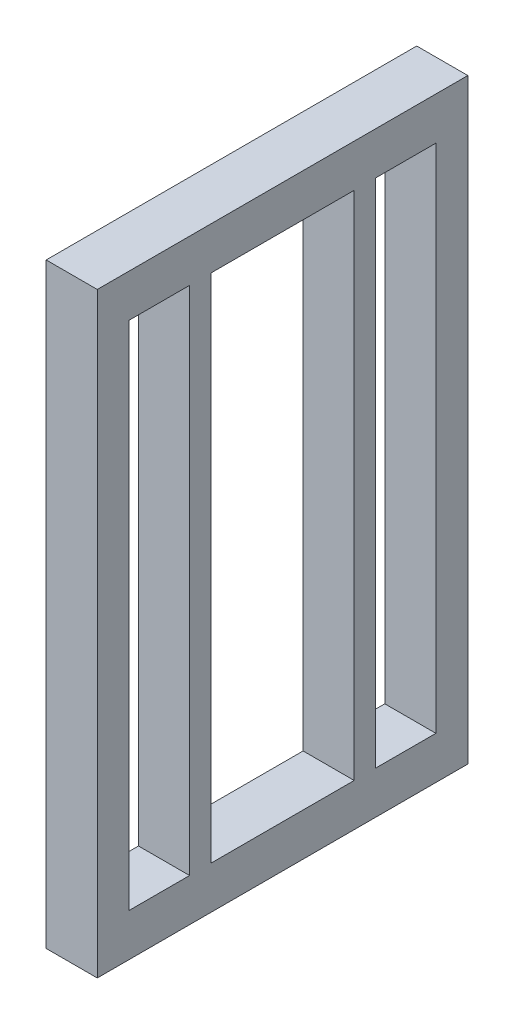
ISO-10303-21;
HEADER;
FILE_DESCRIPTION(('STEP AP214'),'2;1');
FILE_NAME('part.step','',(''),(''),'','','');
FILE_SCHEMA(('AUTOMOTIVE_DESIGN { 1 0 10303 214 1 1 1 1 }'));
ENDSEC;
DATA;
#1=APPLICATION_CONTEXT('core data for automotive mechanical design processes');
#2=APPLICATION_PROTOCOL_DEFINITION('international standard','automotive_design',2000,#1);
#3=PRODUCT_CONTEXT('',#1,'mechanical');
#4=PRODUCT('Part','Part','',(#3));
#5=PRODUCT_RELATED_PRODUCT_CATEGORY('part','',(#4));
#6=PRODUCT_DEFINITION_FORMATION('','',#4);
#7=PRODUCT_DEFINITION_CONTEXT('part definition',#1,'design');
#8=PRODUCT_DEFINITION('design','',#6,#7);
#9=PRODUCT_DEFINITION_SHAPE('','',#8);
#10=(LENGTH_UNIT() NAMED_UNIT(*) SI_UNIT(.MILLI.,.METRE.));
#11=(NAMED_UNIT(*) PLANE_ANGLE_UNIT() SI_UNIT($,.RADIAN.));
#12=(NAMED_UNIT(*) SI_UNIT($,.STERADIAN.) SOLID_ANGLE_UNIT());
#13=UNCERTAINTY_MEASURE_WITH_UNIT(LENGTH_MEASURE(1.E-05),#10,'distance_accuracy_value','');
#14=(GEOMETRIC_REPRESENTATION_CONTEXT(3) GLOBAL_UNCERTAINTY_ASSIGNED_CONTEXT((#13)) GLOBAL_UNIT_ASSIGNED_CONTEXT((#10,
#11,#12)) REPRESENTATION_CONTEXT('',''));
#15=CARTESIAN_POINT('',(0.,0.,0.));
#16=DIRECTION('',(0.,0.,1.));
#17=DIRECTION('',(1.,0.,0.));
#18=AXIS2_PLACEMENT_3D('',#15,#16,#17);
#19=CARTESIAN_POINT('',(-2.47379679144385,56.,-30.0673796791444));
#20=DIRECTION('',(1.,0.,0.));
#21=DIRECTION('',(0.,0.,-1.));
#22=AXIS2_PLACEMENT_3D('',#19,#20,#21);
#23=PLANE('',#22);
#24=DIRECTION('',(0.,-1.,0.));
#25=VECTOR('',#24,1.);
#26=CARTESIAN_POINT('',(-2.47379679144385,56.,-19.3973796791444));
#27=LINE('',#26,#25);
#28=CARTESIAN_POINT('',(-2.47379679144385,52.,-19.3973796791444));
#29=VERTEX_POINT('',#28);
#30=CARTESIAN_POINT('',(-2.47379679144385,4.,-19.3973796791444));
#31=VERTEX_POINT('',#30);
#32=EDGE_CURVE('E271',#29,#31,#27,.T.);
#33=ORIENTED_EDGE('',*,*,#32,.F.);
#34=DIRECTION('',(0.,0.,-1.));
#35=VECTOR('',#34,1.);
#36=CARTESIAN_POINT('',(-2.47379679144385,52.,-30.0673796791444));
#37=LINE('',#36,#35);
#38=CARTESIAN_POINT('',(-2.47379679144385,52.,-5.93737967914438));
#39=VERTEX_POINT('',#38);
#40=EDGE_CURVE('E260',#39,#29,#37,.T.);
#41=ORIENTED_EDGE('',*,*,#40,.F.);
#42=DIRECTION('',(0.,-1.,0.));
#43=VECTOR('',#42,1.);
#44=CARTESIAN_POINT('',(-2.47379679144385,56.,-5.93737967914439));
#45=LINE('',#44,#43);
#46=CARTESIAN_POINT('',(-2.47379679144385,4.,-5.93737967914439));
#47=VERTEX_POINT('',#46);
#48=EDGE_CURVE('E263',#39,#47,#45,.T.);
#49=ORIENTED_EDGE('',*,*,#48,.T.);
#50=DIRECTION('',(0.,0.,-1.));
#51=VECTOR('',#50,1.);
#52=CARTESIAN_POINT('',(-2.47379679144385,4.,-30.0673796791444));
#53=LINE('',#52,#51);
#54=EDGE_CURVE('E267',#47,#31,#53,.T.);
#55=ORIENTED_EDGE('',*,*,#54,.T.);
#56=EDGE_LOOP('',(#33,#41,#49,#55));
#57=FACE_BOUND('',#56,.T.);
#58=DIRECTION('',(0.,0.,1.));
#59=VECTOR('',#58,1.);
#60=CARTESIAN_POINT('',(-2.47379679144385,0.,-30.0673796791444));
#61=LINE('',#60,#59);
#62=CARTESIAN_POINT('',(-2.47379679144385,0.,-30.0673796791444));
#63=VERTEX_POINT('',#62);
#64=CARTESIAN_POINT('',(-2.47379679144385,0.,4.73262032085561));
#65=VERTEX_POINT('',#64);
#66=EDGE_CURVE('E286',#63,#65,#61,.T.);
#67=ORIENTED_EDGE('',*,*,#66,.T.);
#68=DIRECTION('',(0.,-1.,0.));
#69=VECTOR('',#68,1.);
#70=CARTESIAN_POINT('',(-2.47379679144385,56.,4.73262032085561));
#71=LINE('',#70,#69);
#72=CARTESIAN_POINT('',(-2.47379679144385,56.,4.73262032085561));
#73=VERTEX_POINT('',#72);
#74=EDGE_CURVE('E11',#73,#65,#71,.T.);
#75=ORIENTED_EDGE('',*,*,#74,.F.);
#76=DIRECTION('',(0.,0.,1.));
#77=VECTOR('',#76,1.);
#78=CARTESIAN_POINT('',(-2.47379679144385,56.,-30.0673796791444));
#79=LINE('',#78,#77);
#80=CARTESIAN_POINT('',(-2.47379679144385,56.,-30.0673796791444));
#81=VERTEX_POINT('',#80);
#82=EDGE_CURVE('E287',#81,#73,#79,.T.);
#83=ORIENTED_EDGE('',*,*,#82,.F.);
#84=DIRECTION('',(0.,-1.,0.));
#85=VECTOR('',#84,1.);
#86=CARTESIAN_POINT('',(-2.47379679144385,56.,-30.0673796791444));
#87=LINE('',#86,#85);
#88=EDGE_CURVE('E301',#81,#63,#87,.T.);
#89=ORIENTED_EDGE('',*,*,#88,.T.);
#90=EDGE_LOOP('',(#67,#75,#83,#89));
#91=FACE_BOUND('',#90,.T.);
#92=DIRECTION('',(0.,0.,-1.));
#93=VECTOR('',#92,1.);
#94=CARTESIAN_POINT('',(-2.47379679144385,52.,-30.0673796791444));
#95=LINE('',#94,#93);
#96=CARTESIAN_POINT('',(-2.47379679144386,52.,-21.3973796791444));
#97=VERTEX_POINT('',#96);
#98=CARTESIAN_POINT('',(-2.47379679144386,52.,-27.0673796791444));
#99=VERTEX_POINT('',#98);
#100=EDGE_CURVE('E257',#97,#99,#95,.T.);
#101=ORIENTED_EDGE('',*,*,#100,.F.);
#102=DIRECTION('',(0.,-1.,0.));
#103=VECTOR('',#102,1.);
#104=CARTESIAN_POINT('',(-2.47379679144385,56.,-21.3973796791444));
#105=LINE('',#104,#103);
#106=CARTESIAN_POINT('',(-2.47379679144385,4.,-21.3973796791444));
#107=VERTEX_POINT('',#106);
#108=EDGE_CURVE('E185',#97,#107,#105,.T.);
#109=ORIENTED_EDGE('',*,*,#108,.T.);
#110=DIRECTION('',(0.,0.,-1.));
#111=VECTOR('',#110,1.);
#112=CARTESIAN_POINT('',(-2.47379679144385,4.,-30.0673796791444));
#113=LINE('',#112,#111);
#114=CARTESIAN_POINT('',(-2.47379679144386,4.,-27.0673796791444));
#115=VERTEX_POINT('',#114);
#116=EDGE_CURVE('E250',#107,#115,#113,.T.);
#117=ORIENTED_EDGE('',*,*,#116,.T.);
#118=DIRECTION('',(0.,-1.,0.));
#119=VECTOR('',#118,1.);
#120=CARTESIAN_POINT('',(-2.47379679144385,56.,-27.0673796791444));
#121=LINE('',#120,#119);
#122=EDGE_CURVE('E254',#99,#115,#121,.T.);
#123=ORIENTED_EDGE('',*,*,#122,.F.);
#124=EDGE_LOOP('',(#101,#109,#117,#123));
#125=FACE_BOUND('',#124,.T.);
#126=DIRECTION('',(0.,-1.,0.));
#127=VECTOR('',#126,1.);
#128=CARTESIAN_POINT('',(-2.47379679144385,56.,-3.93737967914438));
#129=LINE('',#128,#127);
#130=CARTESIAN_POINT('',(-2.47379679144385,52.,-3.93737967914439));
#131=VERTEX_POINT('',#130);
#132=CARTESIAN_POINT('',(-2.47379679144385,4.,-3.93737967914439));
#133=VERTEX_POINT('',#132);
#134=EDGE_CURVE('E283',#131,#133,#129,.T.);
#135=ORIENTED_EDGE('',*,*,#134,.F.);
#136=DIRECTION('',(0.,0.,-1.));
#137=VECTOR('',#136,1.);
#138=CARTESIAN_POINT('',(-2.47379679144385,52.,-30.0673796791444));
#139=LINE('',#138,#137);
#140=CARTESIAN_POINT('',(-2.47379679144385,52.,1.73262032085562));
#141=VERTEX_POINT('',#140);
#142=EDGE_CURVE('E274',#141,#131,#139,.T.);
#143=ORIENTED_EDGE('',*,*,#142,.F.);
#144=DIRECTION('',(0.,-1.,0.));
#145=VECTOR('',#144,1.);
#146=CARTESIAN_POINT('',(-2.47379679144385,56.,1.73262032085562));
#147=LINE('',#146,#145);
#148=CARTESIAN_POINT('',(-2.47379679144385,4.,1.73262032085561));
#149=VERTEX_POINT('',#148);
#150=EDGE_CURVE('E157',#141,#149,#147,.T.);
#151=ORIENTED_EDGE('',*,*,#150,.T.);
#152=DIRECTION('',(0.,0.,-1.));
#153=VECTOR('',#152,1.);
#154=CARTESIAN_POINT('',(-2.47379679144385,4.,-30.0673796791444));
#155=LINE('',#154,#153);
#156=EDGE_CURVE('E279',#149,#133,#155,.T.);
#157=ORIENTED_EDGE('',*,*,#156,.T.);
#158=EDGE_LOOP('',(#135,#143,#151,#157));
#159=FACE_BOUND('',#158,.T.);
#160=ADVANCED_FACE('F39',(#57,#91,#125,#159),#23,.F.);
#161=CARTESIAN_POINT('',(2.32620320855615,56.,-30.0673796791444));
#162=DIRECTION('',(-1.,0.,0.));
#163=DIRECTION('',(0.,0.,1.));
#164=AXIS2_PLACEMENT_3D('',#161,#162,#163);
#165=PLANE('',#164);
#166=DIRECTION('',(0.,-1.,0.));
#167=VECTOR('',#166,1.);
#168=CARTESIAN_POINT('',(2.32620320855615,0.,-19.3973796791444));
#169=LINE('',#168,#167);
#170=CARTESIAN_POINT('',(2.32620320855615,52.,-19.3973796791444));
#171=VERTEX_POINT('',#170);
#172=CARTESIAN_POINT('',(2.32620320855615,4.,-19.3973796791444));
#173=VERTEX_POINT('',#172);
#174=EDGE_CURVE('E190',#171,#173,#169,.T.);
#175=ORIENTED_EDGE('',*,*,#174,.T.);
#176=DIRECTION('',(0.,0.,-1.));
#177=VECTOR('',#176,1.);
#178=CARTESIAN_POINT('',(2.32620320855615,4.,0.));
#179=LINE('',#178,#177);
#180=CARTESIAN_POINT('',(2.32620320855615,4.,-5.93737967914439));
#181=VERTEX_POINT('',#180);
#182=EDGE_CURVE('E203',#181,#173,#179,.T.);
#183=ORIENTED_EDGE('',*,*,#182,.F.);
#184=DIRECTION('',(0.,-1.,0.));
#185=VECTOR('',#184,1.);
#186=CARTESIAN_POINT('',(2.32620320855615,0.,-5.93737967914439));
#187=LINE('',#186,#185);
#188=CARTESIAN_POINT('',(2.32620320855615,52.,-5.93737967914439));
#189=VERTEX_POINT('',#188);
#190=EDGE_CURVE('E199',#189,#181,#187,.T.);
#191=ORIENTED_EDGE('',*,*,#190,.F.);
#192=DIRECTION('',(0.,0.,-1.));
#193=VECTOR('',#192,1.);
#194=CARTESIAN_POINT('',(2.32620320855615,52.,0.));
#195=LINE('',#194,#193);
#196=EDGE_CURVE('E194',#189,#171,#195,.T.);
#197=ORIENTED_EDGE('',*,*,#196,.T.);
#198=EDGE_LOOP('',(#175,#183,#191,#197));
#199=FACE_BOUND('',#198,.T.);
#200=DIRECTION('',(0.,0.,-1.));
#201=VECTOR('',#200,1.);
#202=CARTESIAN_POINT('',(2.32620320855615,0.,-30.0673796791444));
#203=LINE('',#202,#201);
#204=CARTESIAN_POINT('',(2.32620320855615,0.,4.73262032085561));
#205=VERTEX_POINT('',#204);
#206=CARTESIAN_POINT('',(2.32620320855615,0.,-30.0673796791444));
#207=VERTEX_POINT('',#206);
#208=EDGE_CURVE('E308',#205,#207,#203,.T.);
#209=ORIENTED_EDGE('',*,*,#208,.T.);
#210=DIRECTION('',(0.,-1.,0.));
#211=VECTOR('',#210,1.);
#212=CARTESIAN_POINT('',(2.32620320855615,56.,-30.0673796791444));
#213=LINE('',#212,#211);
#214=CARTESIAN_POINT('',(2.32620320855615,56.,-30.0673796791444));
#215=VERTEX_POINT('',#214);
#216=EDGE_CURVE('E316',#215,#207,#213,.T.);
#217=ORIENTED_EDGE('',*,*,#216,.F.);
#218=DIRECTION('',(0.,0.,-1.));
#219=VECTOR('',#218,1.);
#220=CARTESIAN_POINT('',(2.32620320855615,56.,-30.0673796791444));
#221=LINE('',#220,#219);
#222=CARTESIAN_POINT('',(2.32620320855615,56.,4.73262032085561));
#223=VERTEX_POINT('',#222);
#224=EDGE_CURVE('E295',#223,#215,#221,.T.);
#225=ORIENTED_EDGE('',*,*,#224,.F.);
#226=DIRECTION('',(0.,-1.,0.));
#227=VECTOR('',#226,1.);
#228=CARTESIAN_POINT('',(2.32620320855615,56.,4.73262032085561));
#229=LINE('',#228,#227);
#230=EDGE_CURVE('E47',#223,#205,#229,.T.);
#231=ORIENTED_EDGE('',*,*,#230,.T.);
#232=EDGE_LOOP('',(#209,#217,#225,#231));
#233=FACE_BOUND('',#232,.T.);
#234=DIRECTION('',(0.,0.,-1.));
#235=VECTOR('',#234,1.);
#236=CARTESIAN_POINT('',(2.32620320855615,52.,0.));
#237=LINE('',#236,#235);
#238=CARTESIAN_POINT('',(2.32620320855615,52.,-21.3973796791444));
#239=VERTEX_POINT('',#238);
#240=CARTESIAN_POINT('',(2.32620320855615,52.,-27.0673796791444));
#241=VERTEX_POINT('',#240);
#242=EDGE_CURVE('E219',#239,#241,#237,.T.);
#243=ORIENTED_EDGE('',*,*,#242,.T.);
#244=DIRECTION('',(0.,-1.,0.));
#245=VECTOR('',#244,1.);
#246=CARTESIAN_POINT('',(2.32620320855615,0.,-27.0673796791444));
#247=LINE('',#246,#245);
#248=CARTESIAN_POINT('',(2.32620320855615,4.,-27.0673796791444));
#249=VERTEX_POINT('',#248);
#250=EDGE_CURVE('E231',#241,#249,#247,.T.);
#251=ORIENTED_EDGE('',*,*,#250,.T.);
#252=DIRECTION('',(0.,0.,-1.));
#253=VECTOR('',#252,1.);
#254=CARTESIAN_POINT('',(2.32620320855615,4.,0.));
#255=LINE('',#254,#253);
#256=CARTESIAN_POINT('',(2.32620320855615,4.,-21.3973796791444));
#257=VERTEX_POINT('',#256);
#258=EDGE_CURVE('E227',#257,#249,#255,.T.);
#259=ORIENTED_EDGE('',*,*,#258,.F.);
#260=DIRECTION('',(0.,-1.,0.));
#261=VECTOR('',#260,1.);
#262=CARTESIAN_POINT('',(2.32620320855615,0.,-21.3973796791444));
#263=LINE('',#262,#261);
#264=EDGE_CURVE('E223',#239,#257,#263,.T.);
#265=ORIENTED_EDGE('',*,*,#264,.F.);
#266=EDGE_LOOP('',(#243,#251,#259,#265));
#267=FACE_BOUND('',#266,.T.);
#268=DIRECTION('',(0.,-1.,0.));
#269=VECTOR('',#268,1.);
#270=CARTESIAN_POINT('',(2.32620320855615,0.,-3.93737967914439));
#271=LINE('',#270,#269);
#272=CARTESIAN_POINT('',(2.32620320855615,52.,-3.93737967914438));
#273=VERTEX_POINT('',#272);
#274=CARTESIAN_POINT('',(2.32620320855615,4.,-3.93737967914439));
#275=VERTEX_POINT('',#274);
#276=EDGE_CURVE('E171',#273,#275,#271,.T.);
#277=ORIENTED_EDGE('',*,*,#276,.T.);
#278=DIRECTION('',(0.,0.,-1.));
#279=VECTOR('',#278,1.);
#280=CARTESIAN_POINT('',(2.32620320855615,4.,0.));
#281=LINE('',#280,#279);
#282=CARTESIAN_POINT('',(2.32620320855615,4.,1.73262032085561));
#283=VERTEX_POINT('',#282);
#284=EDGE_CURVE('E175',#283,#275,#281,.T.);
#285=ORIENTED_EDGE('',*,*,#284,.F.);
#286=DIRECTION('',(0.,-1.,0.));
#287=VECTOR('',#286,1.);
#288=CARTESIAN_POINT('',(2.32620320855615,0.,1.73262032085561));
#289=LINE('',#288,#287);
#290=CARTESIAN_POINT('',(2.32620320855615,52.,1.73262032085561));
#291=VERTEX_POINT('',#290);
#292=EDGE_CURVE('E154',#291,#283,#289,.T.);
#293=ORIENTED_EDGE('',*,*,#292,.F.);
#294=DIRECTION('',(0.,0.,-1.));
#295=VECTOR('',#294,1.);
#296=CARTESIAN_POINT('',(2.32620320855615,52.,0.));
#297=LINE('',#296,#295);
#298=EDGE_CURVE('E165',#291,#273,#297,.T.);
#299=ORIENTED_EDGE('',*,*,#298,.T.);
#300=EDGE_LOOP('',(#277,#285,#293,#299));
#301=FACE_BOUND('',#300,.T.);
#302=ADVANCED_FACE('F173',(#199,#233,#267,#301),#165,.F.);
#303=CARTESIAN_POINT('',(-2.47379679144385,56.,4.73262032085561));
#304=DIRECTION('',(0.,0.,-1.));
#305=DIRECTION('',(-1.,0.,0.));
#306=AXIS2_PLACEMENT_3D('',#303,#304,#305);
#307=PLANE('',#306);
#308=DIRECTION('',(1.,0.,0.));
#309=VECTOR('',#308,1.);
#310=CARTESIAN_POINT('',(-2.47379679144385,0.,4.73262032085561));
#311=LINE('',#310,#309);
#312=EDGE_CURVE('E305',#65,#205,#311,.T.);
#313=ORIENTED_EDGE('',*,*,#312,.T.);
#314=ORIENTED_EDGE('',*,*,#230,.F.);
#315=DIRECTION('',(1.,0.,0.));
#316=VECTOR('',#315,1.);
#317=CARTESIAN_POINT('',(-2.47379679144385,56.,4.73262032085561));
#318=LINE('',#317,#316);
#319=EDGE_CURVE('E291',#73,#223,#318,.T.);
#320=ORIENTED_EDGE('',*,*,#319,.F.);
#321=ORIENTED_EDGE('',*,*,#74,.T.);
#322=EDGE_LOOP('',(#313,#314,#320,#321));
#323=FACE_BOUND('',#322,.T.);
#324=ADVANCED_FACE('F342',(#323),#307,.F.);
#325=CARTESIAN_POINT('',(-2.47379679144385,56.,-30.0673796791444));
#326=DIRECTION('',(0.,0.,1.));
#327=DIRECTION('',(1.,0.,0.));
#328=AXIS2_PLACEMENT_3D('',#325,#326,#327);
#329=PLANE('',#328);
#330=DIRECTION('',(-1.,0.,0.));
#331=VECTOR('',#330,1.);
#332=CARTESIAN_POINT('',(-2.47379679144385,0.,-30.0673796791444));
#333=LINE('',#332,#331);
#334=EDGE_CURVE('E292',#207,#63,#333,.T.);
#335=ORIENTED_EDGE('',*,*,#334,.T.);
#336=ORIENTED_EDGE('',*,*,#88,.F.);
#337=DIRECTION('',(-1.,0.,0.));
#338=VECTOR('',#337,1.);
#339=CARTESIAN_POINT('',(-2.47379679144385,56.,-30.0673796791444));
#340=LINE('',#339,#338);
#341=EDGE_CURVE('E298',#215,#81,#340,.T.);
#342=ORIENTED_EDGE('',*,*,#341,.F.);
#343=ORIENTED_EDGE('',*,*,#216,.T.);
#344=EDGE_LOOP('',(#335,#336,#342,#343));
#345=FACE_BOUND('',#344,.T.);
#346=ADVANCED_FACE('F334',(#345),#329,.F.);
#347=CARTESIAN_POINT('',(0.,56.,0.));
#348=DIRECTION('',(0.,1.,0.));
#349=DIRECTION('',(0.,0.,1.));
#350=AXIS2_PLACEMENT_3D('',#347,#348,#349);
#351=PLANE('',#350);
#352=ORIENTED_EDGE('',*,*,#82,.T.);
#353=ORIENTED_EDGE('',*,*,#319,.T.);
#354=ORIENTED_EDGE('',*,*,#224,.T.);
#355=ORIENTED_EDGE('',*,*,#341,.T.);
#356=EDGE_LOOP('',(#352,#353,#354,#355));
#357=FACE_BOUND('',#356,.T.);
#358=ADVANCED_FACE('F341',(#357),#351,.T.);
#359=CARTESIAN_POINT('',(0.,0.,0.));
#360=DIRECTION('',(0.,1.,0.));
#361=DIRECTION('',(0.,0.,1.));
#362=AXIS2_PLACEMENT_3D('',#359,#360,#361);
#363=PLANE('',#362);
#364=ORIENTED_EDGE('',*,*,#66,.F.);
#365=ORIENTED_EDGE('',*,*,#334,.F.);
#366=ORIENTED_EDGE('',*,*,#208,.F.);
#367=ORIENTED_EDGE('',*,*,#312,.F.);
#368=EDGE_LOOP('',(#364,#365,#366,#367));
#369=FACE_BOUND('',#368,.T.);
#370=ADVANCED_FACE('F331',(#369),#363,.F.);
#371=CARTESIAN_POINT('',(-53.6737967914438,52.,0.));
#372=DIRECTION('',(0.,-1.,0.));
#373=DIRECTION('',(0.,0.,-1.));
#374=AXIS2_PLACEMENT_3D('',#371,#372,#373);
#375=PLANE('',#374);
#376=ORIENTED_EDGE('',*,*,#100,.T.);
#377=DIRECTION('',(1.,0.,0.));
#378=VECTOR('',#377,1.);
#379=CARTESIAN_POINT('',(-53.6737967914438,52.,-27.0673796791444));
#380=LINE('',#379,#378);
#381=EDGE_CURVE('E195',#99,#241,#380,.T.);
#382=ORIENTED_EDGE('',*,*,#381,.T.);
#383=ORIENTED_EDGE('',*,*,#242,.F.);
#384=DIRECTION('',(1.,0.,0.));
#385=VECTOR('',#384,1.);
#386=CARTESIAN_POINT('',(-53.6737967914438,52.,-21.3973796791444));
#387=LINE('',#386,#385);
#388=EDGE_CURVE('E235',#97,#239,#387,.T.);
#389=ORIENTED_EDGE('',*,*,#388,.F.);
#390=EDGE_LOOP('',(#376,#382,#383,#389));
#391=FACE_BOUND('',#390,.T.);
#392=ADVANCED_FACE('F387',(#391),#375,.T.);
#393=CARTESIAN_POINT('',(-53.6737967914438,0.,-27.0673796791444));
#394=DIRECTION('',(0.,0.,1.));
#395=DIRECTION('',(0.,-1.,0.));
#396=AXIS2_PLACEMENT_3D('',#393,#394,#395);
#397=PLANE('',#396);
#398=ORIENTED_EDGE('',*,*,#122,.T.);
#399=DIRECTION('',(1.,0.,0.));
#400=VECTOR('',#399,1.);
#401=CARTESIAN_POINT('',(-53.6737967914438,4.,-27.0673796791444));
#402=LINE('',#401,#400);
#403=EDGE_CURVE('E238',#115,#249,#402,.T.);
#404=ORIENTED_EDGE('',*,*,#403,.T.);
#405=ORIENTED_EDGE('',*,*,#250,.F.);
#406=ORIENTED_EDGE('',*,*,#381,.F.);
#407=EDGE_LOOP('',(#398,#404,#405,#406));
#408=FACE_BOUND('',#407,.T.);
#409=ADVANCED_FACE('F383',(#408),#397,.T.);
#410=CARTESIAN_POINT('',(-53.6737967914438,4.,0.));
#411=DIRECTION('',(0.,-1.,0.));
#412=DIRECTION('',(0.,0.,-1.));
#413=AXIS2_PLACEMENT_3D('',#410,#411,#412);
#414=PLANE('',#413);
#415=DIRECTION('',(1.,0.,0.));
#416=VECTOR('',#415,1.);
#417=CARTESIAN_POINT('',(-53.6737967914438,4.,-21.3973796791444));
#418=LINE('',#417,#416);
#419=EDGE_CURVE('E241',#107,#257,#418,.T.);
#420=ORIENTED_EDGE('',*,*,#419,.T.);
#421=ORIENTED_EDGE('',*,*,#258,.T.);
#422=ORIENTED_EDGE('',*,*,#403,.F.);
#423=ORIENTED_EDGE('',*,*,#116,.F.);
#424=EDGE_LOOP('',(#420,#421,#422,#423));
#425=FACE_BOUND('',#424,.T.);
#426=ADVANCED_FACE('F386',(#425),#414,.F.);
#427=CARTESIAN_POINT('',(-53.6737967914438,0.,-21.3973796791444));
#428=DIRECTION('',(0.,0.,1.));
#429=DIRECTION('',(0.,-1.,0.));
#430=AXIS2_PLACEMENT_3D('',#427,#428,#429);
#431=PLANE('',#430);
#432=ORIENTED_EDGE('',*,*,#388,.T.);
#433=ORIENTED_EDGE('',*,*,#264,.T.);
#434=ORIENTED_EDGE('',*,*,#419,.F.);
#435=ORIENTED_EDGE('',*,*,#108,.F.);
#436=EDGE_LOOP('',(#432,#433,#434,#435));
#437=FACE_BOUND('',#436,.T.);
#438=ADVANCED_FACE('F382',(#437),#431,.F.);
#439=CARTESIAN_POINT('',(-53.6737967914438,0.,-19.3973796791444));
#440=DIRECTION('',(0.,0.,1.));
#441=DIRECTION('',(0.,-1.,0.));
#442=AXIS2_PLACEMENT_3D('',#439,#440,#441);
#443=PLANE('',#442);
#444=ORIENTED_EDGE('',*,*,#32,.T.);
#445=DIRECTION('',(1.,0.,0.));
#446=VECTOR('',#445,1.);
#447=CARTESIAN_POINT('',(-53.6737967914438,4.,-19.3973796791444));
#448=LINE('',#447,#446);
#449=EDGE_CURVE('E208',#31,#173,#448,.T.);
#450=ORIENTED_EDGE('',*,*,#449,.T.);
#451=ORIENTED_EDGE('',*,*,#174,.F.);
#452=DIRECTION('',(1.,0.,0.));
#453=VECTOR('',#452,1.);
#454=CARTESIAN_POINT('',(-53.6737967914438,52.,-19.3973796791444));
#455=LINE('',#454,#453);
#456=EDGE_CURVE('E207',#29,#171,#455,.T.);
#457=ORIENTED_EDGE('',*,*,#456,.F.);
#458=EDGE_LOOP('',(#444,#450,#451,#457));
#459=FACE_BOUND('',#458,.T.);
#460=ADVANCED_FACE('F360',(#459),#443,.T.);
#461=CARTESIAN_POINT('',(-53.6737967914438,4.,0.));
#462=DIRECTION('',(0.,-1.,0.));
#463=DIRECTION('',(0.,0.,-1.));
#464=AXIS2_PLACEMENT_3D('',#461,#462,#463);
#465=PLANE('',#464);
#466=DIRECTION('',(1.,0.,0.));
#467=VECTOR('',#466,1.);
#468=CARTESIAN_POINT('',(-53.6737967914438,4.,-5.93737967914438));
#469=LINE('',#468,#467);
#470=EDGE_CURVE('E211',#47,#181,#469,.T.);
#471=ORIENTED_EDGE('',*,*,#470,.T.);
#472=ORIENTED_EDGE('',*,*,#182,.T.);
#473=ORIENTED_EDGE('',*,*,#449,.F.);
#474=ORIENTED_EDGE('',*,*,#54,.F.);
#475=EDGE_LOOP('',(#471,#472,#473,#474));
#476=FACE_BOUND('',#475,.T.);
#477=ADVANCED_FACE('F362',(#476),#465,.F.);
#478=CARTESIAN_POINT('',(-53.6737967914438,0.,-5.93737967914439));
#479=DIRECTION('',(0.,0.,1.));
#480=DIRECTION('',(0.,-1.,0.));
#481=AXIS2_PLACEMENT_3D('',#478,#479,#480);
#482=PLANE('',#481);
#483=DIRECTION('',(1.,0.,0.));
#484=VECTOR('',#483,1.);
#485=CARTESIAN_POINT('',(-53.6737967914438,52.,-5.93737967914438));
#486=LINE('',#485,#484);
#487=EDGE_CURVE('E62',#39,#189,#486,.T.);
#488=ORIENTED_EDGE('',*,*,#487,.T.);
#489=ORIENTED_EDGE('',*,*,#190,.T.);
#490=ORIENTED_EDGE('',*,*,#470,.F.);
#491=ORIENTED_EDGE('',*,*,#48,.F.);
#492=EDGE_LOOP('',(#488,#489,#490,#491));
#493=FACE_BOUND('',#492,.T.);
#494=ADVANCED_FACE('F368',(#493),#482,.F.);
#495=CARTESIAN_POINT('',(-53.6737967914438,52.,0.));
#496=DIRECTION('',(0.,-1.,0.));
#497=DIRECTION('',(0.,0.,-1.));
#498=AXIS2_PLACEMENT_3D('',#495,#496,#497);
#499=PLANE('',#498);
#500=ORIENTED_EDGE('',*,*,#40,.T.);
#501=ORIENTED_EDGE('',*,*,#456,.T.);
#502=ORIENTED_EDGE('',*,*,#196,.F.);
#503=ORIENTED_EDGE('',*,*,#487,.F.);
#504=EDGE_LOOP('',(#500,#501,#502,#503));
#505=FACE_BOUND('',#504,.T.);
#506=ADVANCED_FACE('F366',(#505),#499,.T.);
#507=CARTESIAN_POINT('',(-53.6737967914438,0.,-3.93737967914439));
#508=DIRECTION('',(0.,0.,1.));
#509=DIRECTION('',(0.,-1.,0.));
#510=AXIS2_PLACEMENT_3D('',#507,#508,#509);
#511=PLANE('',#510);
#512=ORIENTED_EDGE('',*,*,#134,.T.);
#513=DIRECTION('',(1.,0.,0.));
#514=VECTOR('',#513,1.);
#515=CARTESIAN_POINT('',(-53.6737967914438,4.,-3.93737967914438));
#516=LINE('',#515,#514);
#517=EDGE_CURVE('E182',#133,#275,#516,.T.);
#518=ORIENTED_EDGE('',*,*,#517,.T.);
#519=ORIENTED_EDGE('',*,*,#276,.F.);
#520=DIRECTION('',(1.,0.,0.));
#521=VECTOR('',#520,1.);
#522=CARTESIAN_POINT('',(-53.6737967914438,52.,-3.93737967914438));
#523=LINE('',#522,#521);
#524=EDGE_CURVE('E161',#131,#273,#523,.T.);
#525=ORIENTED_EDGE('',*,*,#524,.F.);
#526=EDGE_LOOP('',(#512,#518,#519,#525));
#527=FACE_BOUND('',#526,.T.);
#528=ADVANCED_FACE('F375',(#527),#511,.T.);
#529=CARTESIAN_POINT('',(-53.6737967914438,4.,0.));
#530=DIRECTION('',(0.,-1.,0.));
#531=DIRECTION('',(0.,0.,-1.));
#532=AXIS2_PLACEMENT_3D('',#529,#530,#531);
#533=PLANE('',#532);
#534=DIRECTION('',(1.,0.,0.));
#535=VECTOR('',#534,1.);
#536=CARTESIAN_POINT('',(-53.6737967914438,4.,1.73262032085562));
#537=LINE('',#536,#535);
#538=EDGE_CURVE('E160',#149,#283,#537,.T.);
#539=ORIENTED_EDGE('',*,*,#538,.T.);
#540=ORIENTED_EDGE('',*,*,#284,.T.);
#541=ORIENTED_EDGE('',*,*,#517,.F.);
#542=ORIENTED_EDGE('',*,*,#156,.F.);
#543=EDGE_LOOP('',(#539,#540,#541,#542));
#544=FACE_BOUND('',#543,.T.);
#545=ADVANCED_FACE('F449',(#544),#533,.F.);
#546=CARTESIAN_POINT('',(-53.6737967914438,0.,1.73262032085561));
#547=DIRECTION('',(0.,0.,1.));
#548=DIRECTION('',(1.,0.,0.));
#549=AXIS2_PLACEMENT_3D('',#546,#547,#548);
#550=PLANE('',#549);
#551=DIRECTION('',(1.,0.,0.));
#552=VECTOR('',#551,1.);
#553=CARTESIAN_POINT('',(-53.6737967914438,52.,1.73262032085562));
#554=LINE('',#553,#552);
#555=EDGE_CURVE('E54',#141,#291,#554,.T.);
#556=ORIENTED_EDGE('',*,*,#555,.T.);
#557=ORIENTED_EDGE('',*,*,#292,.T.);
#558=ORIENTED_EDGE('',*,*,#538,.F.);
#559=ORIENTED_EDGE('',*,*,#150,.F.);
#560=EDGE_LOOP('',(#556,#557,#558,#559));
#561=FACE_BOUND('',#560,.T.);
#562=ADVANCED_FACE('F151',(#561),#550,.F.);
#563=CARTESIAN_POINT('',(-53.6737967914438,52.,0.));
#564=DIRECTION('',(0.,-1.,0.));
#565=DIRECTION('',(0.,0.,-1.));
#566=AXIS2_PLACEMENT_3D('',#563,#564,#565);
#567=PLANE('',#566);
#568=ORIENTED_EDGE('',*,*,#142,.T.);
#569=ORIENTED_EDGE('',*,*,#524,.T.);
#570=ORIENTED_EDGE('',*,*,#298,.F.);
#571=ORIENTED_EDGE('',*,*,#555,.F.);
#572=EDGE_LOOP('',(#568,#569,#570,#571));
#573=FACE_BOUND('',#572,.T.);
#574=ADVANCED_FACE('F166',(#573),#567,.T.);
#575=CLOSED_SHELL('',(#160,#302,#324,#346,#358,#370,#392,#409,#426,#438,#460,#477,#494,#506,
#528,#545,#562,#574));
#576=MANIFOLD_SOLID_BREP('B2',#575);
#577=ADVANCED_BREP_SHAPE_REPRESENTATION('',(#18,#576),#14);
#578=SHAPE_DEFINITION_REPRESENTATION(#9,#577);
ENDSEC;
END-ISO-10303-21;
